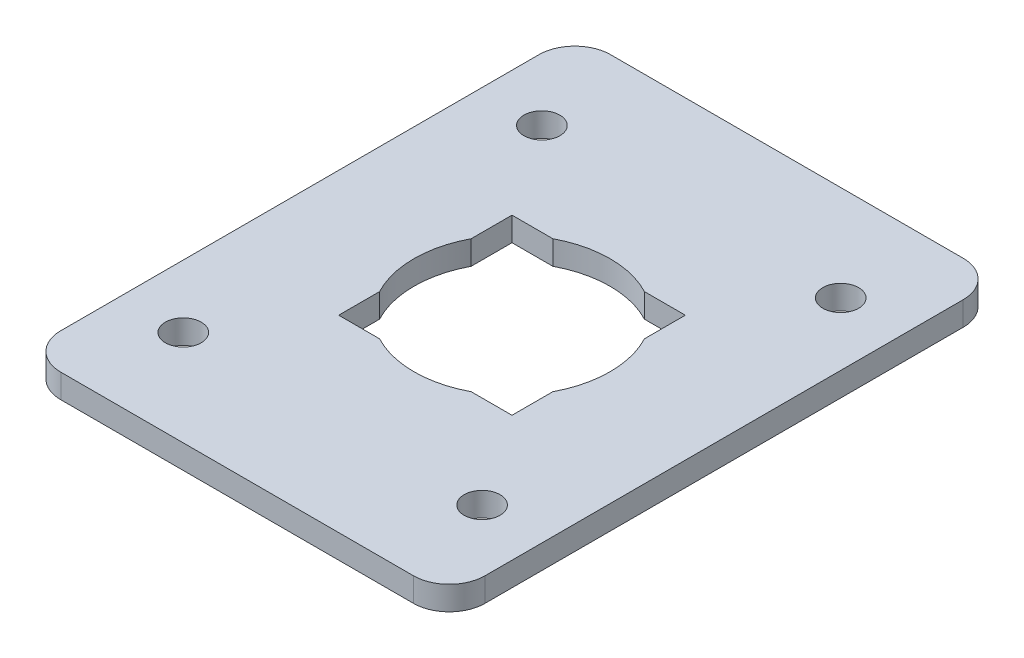
ISO-10303-21;
HEADER;
FILE_DESCRIPTION(('STEP AP214'),'2;1');
FILE_NAME('part.step','',(''),(''),'','','');
FILE_SCHEMA(('AUTOMOTIVE_DESIGN { 1 0 10303 214 1 1 1 1 }'));
ENDSEC;
DATA;
#1=APPLICATION_CONTEXT('core data for automotive mechanical design processes');
#2=APPLICATION_PROTOCOL_DEFINITION('international standard','automotive_design',2000,#1);
#3=PRODUCT_CONTEXT('',#1,'mechanical');
#4=PRODUCT('Part','Part','',(#3));
#5=PRODUCT_RELATED_PRODUCT_CATEGORY('part','',(#4));
#6=PRODUCT_DEFINITION_FORMATION('','',#4);
#7=PRODUCT_DEFINITION_CONTEXT('part definition',#1,'design');
#8=PRODUCT_DEFINITION('design','',#6,#7);
#9=PRODUCT_DEFINITION_SHAPE('','',#8);
#10=(LENGTH_UNIT() NAMED_UNIT(*) SI_UNIT(.MILLI.,.METRE.));
#11=(NAMED_UNIT(*) PLANE_ANGLE_UNIT() SI_UNIT($,.RADIAN.));
#12=(NAMED_UNIT(*) SI_UNIT($,.STERADIAN.) SOLID_ANGLE_UNIT());
#13=UNCERTAINTY_MEASURE_WITH_UNIT(LENGTH_MEASURE(1.E-05),#10,'distance_accuracy_value','');
#14=(GEOMETRIC_REPRESENTATION_CONTEXT(3) GLOBAL_UNCERTAINTY_ASSIGNED_CONTEXT((#13)) GLOBAL_UNIT_ASSIGNED_CONTEXT((#10,
#11,#12)) REPRESENTATION_CONTEXT('',''));
#15=CARTESIAN_POINT('',(0.,0.,0.));
#16=DIRECTION('',(0.,0.,1.));
#17=DIRECTION('',(1.,0.,0.));
#18=AXIS2_PLACEMENT_3D('',#15,#16,#17);
#19=CARTESIAN_POINT('',(0.,2.,0.));
#20=DIRECTION('',(0.,-1.,0.));
#21=DIRECTION('',(0.,0.,-1.));
#22=AXIS2_PLACEMENT_3D('',#19,#20,#21);
#23=PLANE('',#22);
#24=CARTESIAN_POINT('',(-11.6377120476314,2.,-22.25));
#25=DIRECTION('',(0.,-1.,0.));
#26=DIRECTION('',(0.,0.,-1.));
#27=AXIS2_PLACEMENT_3D('',#24,#25,#26);
#28=CIRCLE('',#27,1.5);
#29=CARTESIAN_POINT('',(-11.6377120476314,2.,-23.75));
#30=VERTEX_POINT('',#29);
#31=EDGE_CURVE('E228',#30,#30,#28,.T.);
#32=ORIENTED_EDGE('',*,*,#31,.T.);
#33=EDGE_LOOP('',(#32));
#34=FACE_BOUND('',#33,.T.);
#35=CARTESIAN_POINT('',(13.3622879523686,2.,7.75000000000001));
#36=DIRECTION('',(0.,-1.,0.));
#37=DIRECTION('',(0.,0.,-1.));
#38=AXIS2_PLACEMENT_3D('',#35,#36,#37);
#39=CIRCLE('',#38,1.5);
#40=CARTESIAN_POINT('',(13.3622879523686,2.,6.25000000000001));
#41=VERTEX_POINT('',#40);
#42=EDGE_CURVE('E631',#41,#41,#39,.T.);
#43=ORIENTED_EDGE('',*,*,#42,.T.);
#44=EDGE_LOOP('',(#43));
#45=FACE_BOUND('',#44,.T.);
#46=CARTESIAN_POINT('',(13.3622879523686,2.,-22.25));
#47=DIRECTION('',(0.,-1.,0.));
#48=DIRECTION('',(0.,0.,-1.));
#49=AXIS2_PLACEMENT_3D('',#46,#47,#48);
#50=CIRCLE('',#49,1.5);
#51=CARTESIAN_POINT('',(13.3622879523686,2.,-23.75));
#52=VERTEX_POINT('',#51);
#53=EDGE_CURVE('E633',#52,#52,#50,.T.);
#54=ORIENTED_EDGE('',*,*,#53,.T.);
#55=EDGE_LOOP('',(#54));
#56=FACE_BOUND('',#55,.T.);
#57=CARTESIAN_POINT('',(-11.6377120476314,2.,7.75000000000001));
#58=DIRECTION('',(0.,-1.,0.));
#59=DIRECTION('',(0.,0.,-1.));
#60=AXIS2_PLACEMENT_3D('',#57,#58,#59);
#61=CIRCLE('',#60,1.5);
#62=CARTESIAN_POINT('',(-11.6377120476314,2.,6.25));
#63=VERTEX_POINT('',#62);
#64=EDGE_CURVE('E638',#63,#63,#61,.T.);
#65=ORIENTED_EDGE('',*,*,#64,.T.);
#66=EDGE_LOOP('',(#65));
#67=FACE_BOUND('',#66,.T.);
#68=DIRECTION('',(1.,0.,0.));
#69=VECTOR('',#68,1.);
#70=CARTESIAN_POINT('',(-16.8877120476314,2.,15.75));
#71=LINE('',#70,#69);
#72=CARTESIAN_POINT('',(-13.8877120476314,2.,15.75));
#73=VERTEX_POINT('',#72);
#74=CARTESIAN_POINT('',(15.6122879523686,2.,15.75));
#75=VERTEX_POINT('',#74);
#76=EDGE_CURVE('E282',#73,#75,#71,.T.);
#77=ORIENTED_EDGE('',*,*,#76,.T.);
#78=CARTESIAN_POINT('',(15.6122879523686,2.,12.75));
#79=DIRECTION('',(0.,-1.,0.));
#80=DIRECTION('',(0.,0.,-1.));
#81=AXIS2_PLACEMENT_3D('',#78,#79,#80);
#82=CIRCLE('',#81,3.);
#83=CARTESIAN_POINT('',(18.6122879523686,2.,12.75));
#84=VERTEX_POINT('',#83);
#85=EDGE_CURVE('E322',#75,#84,#82,.F.);
#86=ORIENTED_EDGE('',*,*,#85,.T.);
#87=DIRECTION('',(0.,0.,-1.));
#88=VECTOR('',#87,1.);
#89=CARTESIAN_POINT('',(18.6122879523686,2.,15.75));
#90=LINE('',#89,#88);
#91=CARTESIAN_POINT('',(18.6122879523686,2.,-27.25));
#92=VERTEX_POINT('',#91);
#93=EDGE_CURVE('E286',#84,#92,#90,.T.);
#94=ORIENTED_EDGE('',*,*,#93,.T.);
#95=CARTESIAN_POINT('',(15.6122879523686,2.,-27.25));
#96=DIRECTION('',(0.,-1.,0.));
#97=DIRECTION('',(0.,0.,-1.));
#98=AXIS2_PLACEMENT_3D('',#95,#96,#97);
#99=CIRCLE('',#98,3.);
#100=CARTESIAN_POINT('',(15.6122879523686,2.,-30.25));
#101=VERTEX_POINT('',#100);
#102=EDGE_CURVE('E61',#92,#101,#99,.F.);
#103=ORIENTED_EDGE('',*,*,#102,.T.);
#104=DIRECTION('',(-1.,0.,0.));
#105=VECTOR('',#104,1.);
#106=CARTESIAN_POINT('',(-16.8877120476314,2.,-30.25));
#107=LINE('',#106,#105);
#108=CARTESIAN_POINT('',(-13.8877120476314,2.,-30.25));
#109=VERTEX_POINT('',#108);
#110=EDGE_CURVE('E288',#101,#109,#107,.T.);
#111=ORIENTED_EDGE('',*,*,#110,.T.);
#112=CARTESIAN_POINT('',(-13.8877120476314,2.,-27.25));
#113=DIRECTION('',(0.,-1.,0.));
#114=DIRECTION('',(0.,0.,-1.));
#115=AXIS2_PLACEMENT_3D('',#112,#113,#114);
#116=CIRCLE('',#115,3.);
#117=CARTESIAN_POINT('',(-16.8877120476314,2.,-27.25));
#118=VERTEX_POINT('',#117);
#119=EDGE_CURVE('E318',#109,#118,#116,.F.);
#120=ORIENTED_EDGE('',*,*,#119,.T.);
#121=DIRECTION('',(0.,0.,1.));
#122=VECTOR('',#121,1.);
#123=CARTESIAN_POINT('',(-16.8877120476314,2.,15.75));
#124=LINE('',#123,#122);
#125=CARTESIAN_POINT('',(-16.8877120476314,2.,12.75));
#126=VERTEX_POINT('',#125);
#127=EDGE_CURVE('E279',#118,#126,#124,.T.);
#128=ORIENTED_EDGE('',*,*,#127,.T.);
#129=CARTESIAN_POINT('',(-13.8877120476314,2.,12.75));
#130=DIRECTION('',(0.,-1.,0.));
#131=DIRECTION('',(0.,0.,-1.));
#132=AXIS2_PLACEMENT_3D('',#129,#130,#131);
#133=CIRCLE('',#132,3.);
#134=EDGE_CURVE('E320',#126,#73,#133,.F.);
#135=ORIENTED_EDGE('',*,*,#134,.T.);
#136=EDGE_LOOP('',(#77,#86,#94,#103,#111,#120,#128,#135));
#137=FACE_BOUND('',#136,.T.);
#138=DIRECTION('',(1.,0.,0.));
#139=VECTOR('',#138,1.);
#140=CARTESIAN_POINT('',(4.69341050326672,2.,0.));
#141=LINE('',#140,#139);
#142=CARTESIAN_POINT('',(4.69341050326672,2.,0.));
#143=VERTEX_POINT('',#142);
#144=CARTESIAN_POINT('',(8.11228795236863,2.,0.));
#145=VERTEX_POINT('',#144);
#146=EDGE_CURVE('E179',#143,#145,#141,.T.);
#147=ORIENTED_EDGE('',*,*,#146,.F.);
#148=CARTESIAN_POINT('',(0.862287952368626,2.,-7.25));
#149=DIRECTION('',(0.,1.,0.));
#150=DIRECTION('',(0.,0.,1.));
#151=AXIS2_PLACEMENT_3D('',#148,#149,#150);
#152=CIRCLE('',#151,8.2);
#153=CARTESIAN_POINT('',(-2.96883459852947,2.,0.));
#154=VERTEX_POINT('',#153);
#155=EDGE_CURVE('E224',#154,#143,#152,.T.);
#156=ORIENTED_EDGE('',*,*,#155,.F.);
#157=DIRECTION('',(1.,0.,0.));
#158=VECTOR('',#157,1.);
#159=CARTESIAN_POINT('',(-6.38771204763137,2.,0.));
#160=LINE('',#159,#158);
#161=CARTESIAN_POINT('',(-6.38771204763137,2.,0.));
#162=VERTEX_POINT('',#161);
#163=EDGE_CURVE('E221',#162,#154,#160,.T.);
#164=ORIENTED_EDGE('',*,*,#163,.F.);
#165=DIRECTION('',(0.,0.,1.));
#166=VECTOR('',#165,1.);
#167=CARTESIAN_POINT('',(-6.38771204763137,2.,-3.4188774491019));
#168=LINE('',#167,#166);
#169=CARTESIAN_POINT('',(-6.38771204763138,2.,-3.4188774491019));
#170=VERTEX_POINT('',#169);
#171=EDGE_CURVE('E219',#170,#162,#168,.T.);
#172=ORIENTED_EDGE('',*,*,#171,.F.);
#173=CARTESIAN_POINT('',(0.862287952368626,2.,-7.25));
#174=DIRECTION('',(0.,1.,0.));
#175=DIRECTION('',(0.,0.,1.));
#176=AXIS2_PLACEMENT_3D('',#173,#174,#175);
#177=CIRCLE('',#176,8.2);
#178=CARTESIAN_POINT('',(-6.38771204763137,2.,-11.0811225508981));
#179=VERTEX_POINT('',#178);
#180=EDGE_CURVE('E217',#179,#170,#177,.T.);
#181=ORIENTED_EDGE('',*,*,#180,.F.);
#182=DIRECTION('',(0.,0.,1.));
#183=VECTOR('',#182,1.);
#184=CARTESIAN_POINT('',(-6.38771204763137,2.,-14.5));
#185=LINE('',#184,#183);
#186=CARTESIAN_POINT('',(-6.38771204763137,2.,-14.5));
#187=VERTEX_POINT('',#186);
#188=EDGE_CURVE('E215',#187,#179,#185,.T.);
#189=ORIENTED_EDGE('',*,*,#188,.F.);
#190=DIRECTION('',(-1.,0.,0.));
#191=VECTOR('',#190,1.);
#192=CARTESIAN_POINT('',(-6.38771204763137,2.,-14.5));
#193=LINE('',#192,#191);
#194=CARTESIAN_POINT('',(-2.96883459852948,2.,-14.5));
#195=VERTEX_POINT('',#194);
#196=EDGE_CURVE('E213',#195,#187,#193,.T.);
#197=ORIENTED_EDGE('',*,*,#196,.F.);
#198=CARTESIAN_POINT('',(0.862287952368626,2.,-7.25));
#199=DIRECTION('',(0.,1.,0.));
#200=DIRECTION('',(0.,0.,1.));
#201=AXIS2_PLACEMENT_3D('',#198,#199,#200);
#202=CIRCLE('',#201,8.2);
#203=CARTESIAN_POINT('',(4.69341050326674,2.,-14.5));
#204=VERTEX_POINT('',#203);
#205=EDGE_CURVE('E211',#204,#195,#202,.T.);
#206=ORIENTED_EDGE('',*,*,#205,.F.);
#207=DIRECTION('',(-1.,0.,0.));
#208=VECTOR('',#207,1.);
#209=CARTESIAN_POINT('',(4.69341050326674,2.,-14.5));
#210=LINE('',#209,#208);
#211=CARTESIAN_POINT('',(8.11228795236863,2.,-14.5));
#212=VERTEX_POINT('',#211);
#213=EDGE_CURVE('E209',#212,#204,#210,.T.);
#214=ORIENTED_EDGE('',*,*,#213,.F.);
#215=DIRECTION('',(0.,0.,-1.));
#216=VECTOR('',#215,1.);
#217=CARTESIAN_POINT('',(8.11228795236863,2.,-14.5));
#218=LINE('',#217,#216);
#219=CARTESIAN_POINT('',(8.11228795236863,2.,-11.0811225508981));
#220=VERTEX_POINT('',#219);
#221=EDGE_CURVE('E204',#220,#212,#218,.T.);
#222=ORIENTED_EDGE('',*,*,#221,.F.);
#223=CARTESIAN_POINT('',(0.862287952368626,2.,-7.25));
#224=DIRECTION('',(0.,1.,0.));
#225=DIRECTION('',(0.,0.,1.));
#226=AXIS2_PLACEMENT_3D('',#223,#224,#225);
#227=CIRCLE('',#226,8.2);
#228=CARTESIAN_POINT('',(8.11228795236863,2.,-3.4188774491019));
#229=VERTEX_POINT('',#228);
#230=EDGE_CURVE('E202',#229,#220,#227,.T.);
#231=ORIENTED_EDGE('',*,*,#230,.F.);
#232=DIRECTION('',(0.,0.,-1.));
#233=VECTOR('',#232,1.);
#234=CARTESIAN_POINT('',(8.11228795236863,2.,-3.4188774491019));
#235=LINE('',#234,#233);
#236=EDGE_CURVE('E189',#145,#229,#235,.T.);
#237=ORIENTED_EDGE('',*,*,#236,.F.);
#238=EDGE_LOOP('',(#147,#156,#164,#172,#181,#189,#197,#206,#214,#222,#231,#237));
#239=FACE_BOUND('',#238,.T.);
#240=ADVANCED_FACE('F41',(#34,#45,#56,#67,#137,#239),#23,.F.);
#241=CARTESIAN_POINT('',(0.,0.,0.));
#242=DIRECTION('',(0.,-1.,0.));
#243=DIRECTION('',(0.,0.,-1.));
#244=AXIS2_PLACEMENT_3D('',#241,#242,#243);
#245=PLANE('',#244);
#246=CARTESIAN_POINT('',(-11.6377120476314,0.,-22.25));
#247=DIRECTION('',(0.,-1.,0.));
#248=DIRECTION('',(0.,0.,1.));
#249=AXIS2_PLACEMENT_3D('',#246,#247,#248);
#250=CIRCLE('',#249,1.5);
#251=CARTESIAN_POINT('',(-11.6377120476314,0.,-20.75));
#252=VERTEX_POINT('',#251);
#253=EDGE_CURVE('E629',#252,#252,#250,.T.);
#254=ORIENTED_EDGE('',*,*,#253,.F.);
#255=EDGE_LOOP('',(#254));
#256=FACE_BOUND('',#255,.T.);
#257=CARTESIAN_POINT('',(13.3622879523686,0.,7.75000000000001));
#258=DIRECTION('',(0.,-1.,0.));
#259=DIRECTION('',(0.,0.,1.));
#260=AXIS2_PLACEMENT_3D('',#257,#258,#259);
#261=CIRCLE('',#260,1.5);
#262=CARTESIAN_POINT('',(13.3622879523686,0.,9.25000000000001));
#263=VERTEX_POINT('',#262);
#264=EDGE_CURVE('E646',#263,#263,#261,.T.);
#265=ORIENTED_EDGE('',*,*,#264,.F.);
#266=EDGE_LOOP('',(#265));
#267=FACE_BOUND('',#266,.T.);
#268=CARTESIAN_POINT('',(13.3622879523686,0.,-22.25));
#269=DIRECTION('',(0.,-1.,0.));
#270=DIRECTION('',(0.,0.,-1.));
#271=AXIS2_PLACEMENT_3D('',#268,#269,#270);
#272=CIRCLE('',#271,1.5);
#273=CARTESIAN_POINT('',(13.3622879523686,0.,-23.75));
#274=VERTEX_POINT('',#273);
#275=EDGE_CURVE('E644',#274,#274,#272,.T.);
#276=ORIENTED_EDGE('',*,*,#275,.F.);
#277=EDGE_LOOP('',(#276));
#278=FACE_BOUND('',#277,.T.);
#279=CARTESIAN_POINT('',(-11.6377120476314,0.,7.75000000000001));
#280=DIRECTION('',(0.,-1.,0.));
#281=DIRECTION('',(0.,0.,-1.));
#282=AXIS2_PLACEMENT_3D('',#279,#280,#281);
#283=CIRCLE('',#282,1.5);
#284=CARTESIAN_POINT('',(-11.6377120476314,0.,6.25));
#285=VERTEX_POINT('',#284);
#286=EDGE_CURVE('E641',#285,#285,#283,.T.);
#287=ORIENTED_EDGE('',*,*,#286,.F.);
#288=EDGE_LOOP('',(#287));
#289=FACE_BOUND('',#288,.T.);
#290=DIRECTION('',(0.,0.,-1.));
#291=VECTOR('',#290,1.);
#292=CARTESIAN_POINT('',(18.6122879523686,0.,15.75));
#293=LINE('',#292,#291);
#294=CARTESIAN_POINT('',(18.6122879523686,0.,12.75));
#295=VERTEX_POINT('',#294);
#296=CARTESIAN_POINT('',(18.6122879523686,0.,-27.25));
#297=VERTEX_POINT('',#296);
#298=EDGE_CURVE('E296',#295,#297,#293,.T.);
#299=ORIENTED_EDGE('',*,*,#298,.F.);
#300=CARTESIAN_POINT('',(15.6122879523686,0.,12.75));
#301=DIRECTION('',(0.,-1.,0.));
#302=DIRECTION('',(0.,0.,-1.));
#303=AXIS2_PLACEMENT_3D('',#300,#301,#302);
#304=CIRCLE('',#303,3.);
#305=CARTESIAN_POINT('',(15.6122879523686,0.,15.75));
#306=VERTEX_POINT('',#305);
#307=EDGE_CURVE('E310',#295,#306,#304,.T.);
#308=ORIENTED_EDGE('',*,*,#307,.T.);
#309=DIRECTION('',(1.,0.,0.));
#310=VECTOR('',#309,1.);
#311=CARTESIAN_POINT('',(-16.8877120476314,0.,15.75));
#312=LINE('',#311,#310);
#313=CARTESIAN_POINT('',(-13.8877120476314,0.,15.75));
#314=VERTEX_POINT('',#313);
#315=EDGE_CURVE('E293',#314,#306,#312,.T.);
#316=ORIENTED_EDGE('',*,*,#315,.F.);
#317=CARTESIAN_POINT('',(-13.8877120476314,0.,12.75));
#318=DIRECTION('',(0.,-1.,0.));
#319=DIRECTION('',(0.,0.,-1.));
#320=AXIS2_PLACEMENT_3D('',#317,#318,#319);
#321=CIRCLE('',#320,3.);
#322=CARTESIAN_POINT('',(-16.8877120476314,0.,12.75));
#323=VERTEX_POINT('',#322);
#324=EDGE_CURVE('E308',#314,#323,#321,.T.);
#325=ORIENTED_EDGE('',*,*,#324,.T.);
#326=DIRECTION('',(0.,0.,1.));
#327=VECTOR('',#326,1.);
#328=CARTESIAN_POINT('',(-16.8877120476314,0.,15.75));
#329=LINE('',#328,#327);
#330=CARTESIAN_POINT('',(-16.8877120476314,0.,-27.25));
#331=VERTEX_POINT('',#330);
#332=EDGE_CURVE('E197',#331,#323,#329,.T.);
#333=ORIENTED_EDGE('',*,*,#332,.F.);
#334=CARTESIAN_POINT('',(-13.8877120476314,0.,-27.25));
#335=DIRECTION('',(0.,-1.,0.));
#336=DIRECTION('',(0.,0.,-1.));
#337=AXIS2_PLACEMENT_3D('',#334,#335,#336);
#338=CIRCLE('',#337,3.);
#339=CARTESIAN_POINT('',(-13.8877120476314,0.,-30.25));
#340=VERTEX_POINT('',#339);
#341=EDGE_CURVE('E306',#331,#340,#338,.T.);
#342=ORIENTED_EDGE('',*,*,#341,.T.);
#343=DIRECTION('',(-1.,0.,0.));
#344=VECTOR('',#343,1.);
#345=CARTESIAN_POINT('',(-16.8877120476314,0.,-30.25));
#346=LINE('',#345,#344);
#347=CARTESIAN_POINT('',(15.6122879523686,0.,-30.25));
#348=VERTEX_POINT('',#347);
#349=EDGE_CURVE('E283',#348,#340,#346,.T.);
#350=ORIENTED_EDGE('',*,*,#349,.F.);
#351=CARTESIAN_POINT('',(15.6122879523686,0.,-27.25));
#352=DIRECTION('',(0.,-1.,0.));
#353=DIRECTION('',(0.,0.,-1.));
#354=AXIS2_PLACEMENT_3D('',#351,#352,#353);
#355=CIRCLE('',#354,3.);
#356=EDGE_CURVE('E304',#348,#297,#355,.T.);
#357=ORIENTED_EDGE('',*,*,#356,.T.);
#358=EDGE_LOOP('',(#299,#308,#316,#325,#333,#342,#350,#357));
#359=FACE_BOUND('',#358,.T.);
#360=CARTESIAN_POINT('',(0.862287952368626,0.,-7.25));
#361=DIRECTION('',(0.,1.,0.));
#362=DIRECTION('',(0.,0.,1.));
#363=AXIS2_PLACEMENT_3D('',#360,#361,#362);
#364=CIRCLE('',#363,8.2);
#365=CARTESIAN_POINT('',(-2.96883459852947,0.,0.));
#366=VERTEX_POINT('',#365);
#367=CARTESIAN_POINT('',(4.69341050326672,0.,0.));
#368=VERTEX_POINT('',#367);
#369=EDGE_CURVE('E190',#366,#368,#364,.T.);
#370=ORIENTED_EDGE('',*,*,#369,.T.);
#371=DIRECTION('',(1.,0.,0.));
#372=VECTOR('',#371,1.);
#373=CARTESIAN_POINT('',(4.69341050326672,0.,0.));
#374=LINE('',#373,#372);
#375=CARTESIAN_POINT('',(8.11228795236863,0.,0.));
#376=VERTEX_POINT('',#375);
#377=EDGE_CURVE('E226',#368,#376,#374,.T.);
#378=ORIENTED_EDGE('',*,*,#377,.T.);
#379=DIRECTION('',(0.,0.,-1.));
#380=VECTOR('',#379,1.);
#381=CARTESIAN_POINT('',(8.11228795236863,0.,-3.4188774491019));
#382=LINE('',#381,#380);
#383=CARTESIAN_POINT('',(8.11228795236863,0.,-3.4188774491019));
#384=VERTEX_POINT('',#383);
#385=EDGE_CURVE('E196',#376,#384,#382,.T.);
#386=ORIENTED_EDGE('',*,*,#385,.T.);
#387=CARTESIAN_POINT('',(0.862287952368626,0.,-7.25));
#388=DIRECTION('',(0.,1.,0.));
#389=DIRECTION('',(0.,0.,1.));
#390=AXIS2_PLACEMENT_3D('',#387,#388,#389);
#391=CIRCLE('',#390,8.2);
#392=CARTESIAN_POINT('',(8.11228795236863,0.,-11.0811225508981));
#393=VERTEX_POINT('',#392);
#394=EDGE_CURVE('E230',#384,#393,#391,.T.);
#395=ORIENTED_EDGE('',*,*,#394,.T.);
#396=DIRECTION('',(0.,0.,-1.));
#397=VECTOR('',#396,1.);
#398=CARTESIAN_POINT('',(8.11228795236863,0.,-14.5));
#399=LINE('',#398,#397);
#400=CARTESIAN_POINT('',(8.11228795236863,0.,-14.5));
#401=VERTEX_POINT('',#400);
#402=EDGE_CURVE('E233',#393,#401,#399,.T.);
#403=ORIENTED_EDGE('',*,*,#402,.T.);
#404=DIRECTION('',(-1.,0.,0.));
#405=VECTOR('',#404,1.);
#406=CARTESIAN_POINT('',(4.69341050326674,0.,-14.5));
#407=LINE('',#406,#405);
#408=CARTESIAN_POINT('',(4.69341050326674,0.,-14.5));
#409=VERTEX_POINT('',#408);
#410=EDGE_CURVE('E236',#401,#409,#407,.T.);
#411=ORIENTED_EDGE('',*,*,#410,.T.);
#412=CARTESIAN_POINT('',(0.862287952368626,0.,-7.25));
#413=DIRECTION('',(0.,1.,0.));
#414=DIRECTION('',(0.,0.,1.));
#415=AXIS2_PLACEMENT_3D('',#412,#413,#414);
#416=CIRCLE('',#415,8.2);
#417=CARTESIAN_POINT('',(-2.96883459852948,0.,-14.5));
#418=VERTEX_POINT('',#417);
#419=EDGE_CURVE('E239',#409,#418,#416,.T.);
#420=ORIENTED_EDGE('',*,*,#419,.T.);
#421=DIRECTION('',(-1.,0.,0.));
#422=VECTOR('',#421,1.);
#423=CARTESIAN_POINT('',(-6.38771204763137,0.,-14.5));
#424=LINE('',#423,#422);
#425=CARTESIAN_POINT('',(-6.38771204763137,0.,-14.5));
#426=VERTEX_POINT('',#425);
#427=EDGE_CURVE('E242',#418,#426,#424,.T.);
#428=ORIENTED_EDGE('',*,*,#427,.T.);
#429=DIRECTION('',(0.,0.,1.));
#430=VECTOR('',#429,1.);
#431=CARTESIAN_POINT('',(-6.38771204763137,0.,-14.5));
#432=LINE('',#431,#430);
#433=CARTESIAN_POINT('',(-6.38771204763137,0.,-11.0811225508981));
#434=VERTEX_POINT('',#433);
#435=EDGE_CURVE('E245',#426,#434,#432,.T.);
#436=ORIENTED_EDGE('',*,*,#435,.T.);
#437=CARTESIAN_POINT('',(0.862287952368626,0.,-7.25));
#438=DIRECTION('',(0.,1.,0.));
#439=DIRECTION('',(0.,0.,1.));
#440=AXIS2_PLACEMENT_3D('',#437,#438,#439);
#441=CIRCLE('',#440,8.2);
#442=CARTESIAN_POINT('',(-6.38771204763138,0.,-3.4188774491019));
#443=VERTEX_POINT('',#442);
#444=EDGE_CURVE('E248',#434,#443,#441,.T.);
#445=ORIENTED_EDGE('',*,*,#444,.T.);
#446=DIRECTION('',(0.,0.,1.));
#447=VECTOR('',#446,1.);
#448=CARTESIAN_POINT('',(-6.38771204763137,0.,-3.4188774491019));
#449=LINE('',#448,#447);
#450=CARTESIAN_POINT('',(-6.38771204763137,0.,0.));
#451=VERTEX_POINT('',#450);
#452=EDGE_CURVE('E251',#443,#451,#449,.T.);
#453=ORIENTED_EDGE('',*,*,#452,.T.);
#454=DIRECTION('',(1.,0.,0.));
#455=VECTOR('',#454,1.);
#456=CARTESIAN_POINT('',(-6.38771204763137,0.,0.));
#457=LINE('',#456,#455);
#458=EDGE_CURVE('E254',#451,#366,#457,.T.);
#459=ORIENTED_EDGE('',*,*,#458,.T.);
#460=EDGE_LOOP('',(#370,#378,#386,#395,#403,#411,#420,#428,#436,#445,#453,#459));
#461=FACE_BOUND('',#460,.T.);
#462=ADVANCED_FACE('F335',(#256,#267,#278,#289,#359,#461),#245,.T.);
#463=CARTESIAN_POINT('',(-16.8877120476314,2.,15.75));
#464=DIRECTION('',(1.,0.,0.));
#465=DIRECTION('',(0.,0.,-1.));
#466=AXIS2_PLACEMENT_3D('',#463,#464,#465);
#467=PLANE('',#466);
#468=ORIENTED_EDGE('',*,*,#332,.T.);
#469=DIRECTION('',(0.,-1.,0.));
#470=VECTOR('',#469,1.);
#471=CARTESIAN_POINT('',(-16.8877120476314,2.,12.75));
#472=LINE('',#471,#470);
#473=EDGE_CURVE('E327',#323,#126,#472,.F.);
#474=ORIENTED_EDGE('',*,*,#473,.T.);
#475=ORIENTED_EDGE('',*,*,#127,.F.);
#476=DIRECTION('',(0.,-1.,0.));
#477=VECTOR('',#476,1.);
#478=CARTESIAN_POINT('',(-16.8877120476314,2.,-27.25));
#479=LINE('',#478,#477);
#480=EDGE_CURVE('E324',#118,#331,#479,.T.);
#481=ORIENTED_EDGE('',*,*,#480,.T.);
#482=EDGE_LOOP('',(#468,#474,#475,#481));
#483=FACE_BOUND('',#482,.T.);
#484=ADVANCED_FACE('F344',(#483),#467,.F.);
#485=CARTESIAN_POINT('',(-16.8877120476314,2.,15.75));
#486=DIRECTION('',(0.,0.,-1.));
#487=DIRECTION('',(-1.,0.,0.));
#488=AXIS2_PLACEMENT_3D('',#485,#486,#487);
#489=PLANE('',#488);
#490=ORIENTED_EDGE('',*,*,#315,.T.);
#491=DIRECTION('',(0.,-1.,0.));
#492=VECTOR('',#491,1.);
#493=CARTESIAN_POINT('',(15.6122879523686,2.,15.75));
#494=LINE('',#493,#492);
#495=EDGE_CURVE('E315',#306,#75,#494,.F.);
#496=ORIENTED_EDGE('',*,*,#495,.T.);
#497=ORIENTED_EDGE('',*,*,#76,.F.);
#498=DIRECTION('',(0.,-1.,0.));
#499=VECTOR('',#498,1.);
#500=CARTESIAN_POINT('',(-13.8877120476314,2.,15.75));
#501=LINE('',#500,#499);
#502=EDGE_CURVE('E312',#73,#314,#501,.T.);
#503=ORIENTED_EDGE('',*,*,#502,.T.);
#504=EDGE_LOOP('',(#490,#496,#497,#503));
#505=FACE_BOUND('',#504,.T.);
#506=ADVANCED_FACE('F353',(#505),#489,.F.);
#507=CARTESIAN_POINT('',(18.6122879523686,2.,15.75));
#508=DIRECTION('',(-1.,0.,0.));
#509=DIRECTION('',(0.,0.,1.));
#510=AXIS2_PLACEMENT_3D('',#507,#508,#509);
#511=PLANE('',#510);
#512=ORIENTED_EDGE('',*,*,#93,.F.);
#513=DIRECTION('',(0.,-1.,0.));
#514=VECTOR('',#513,1.);
#515=CARTESIAN_POINT('',(18.6122879523686,2.,12.75));
#516=LINE('',#515,#514);
#517=EDGE_CURVE('E301',#84,#295,#516,.T.);
#518=ORIENTED_EDGE('',*,*,#517,.T.);
#519=ORIENTED_EDGE('',*,*,#298,.T.);
#520=DIRECTION('',(0.,-1.,0.));
#521=VECTOR('',#520,1.);
#522=CARTESIAN_POINT('',(18.6122879523686,2.,-27.25));
#523=LINE('',#522,#521);
#524=EDGE_CURVE('E290',#297,#92,#523,.F.);
#525=ORIENTED_EDGE('',*,*,#524,.T.);
#526=EDGE_LOOP('',(#512,#518,#519,#525));
#527=FACE_BOUND('',#526,.T.);
#528=ADVANCED_FACE('F361',(#527),#511,.F.);
#529=CARTESIAN_POINT('',(-16.8877120476314,2.,-30.25));
#530=DIRECTION('',(0.,0.,1.));
#531=DIRECTION('',(1.,0.,0.));
#532=AXIS2_PLACEMENT_3D('',#529,#530,#531);
#533=PLANE('',#532);
#534=ORIENTED_EDGE('',*,*,#349,.T.);
#535=DIRECTION('',(0.,-1.,0.));
#536=VECTOR('',#535,1.);
#537=CARTESIAN_POINT('',(-13.8877120476314,2.,-30.25));
#538=LINE('',#537,#536);
#539=EDGE_CURVE('E11',#340,#109,#538,.F.);
#540=ORIENTED_EDGE('',*,*,#539,.T.);
#541=ORIENTED_EDGE('',*,*,#110,.F.);
#542=DIRECTION('',(0.,-1.,0.));
#543=VECTOR('',#542,1.);
#544=CARTESIAN_POINT('',(15.6122879523686,2.,-30.25));
#545=LINE('',#544,#543);
#546=EDGE_CURVE('E49',#101,#348,#545,.T.);
#547=ORIENTED_EDGE('',*,*,#546,.T.);
#548=EDGE_LOOP('',(#534,#540,#541,#547));
#549=FACE_BOUND('',#548,.T.);
#550=ADVANCED_FACE('F331',(#549),#533,.F.);
#551=CARTESIAN_POINT('',(4.69341050326672,2.,0.));
#552=DIRECTION('',(0.,0.,-1.));
#553=DIRECTION('',(-1.,0.,0.));
#554=AXIS2_PLACEMENT_3D('',#551,#552,#553);
#555=PLANE('',#554);
#556=ORIENTED_EDGE('',*,*,#377,.F.);
#557=DIRECTION('',(0.,-1.,0.));
#558=VECTOR('',#557,1.);
#559=CARTESIAN_POINT('',(4.69341050326672,2.,0.));
#560=LINE('',#559,#558);
#561=EDGE_CURVE('E185',#143,#368,#560,.T.);
#562=ORIENTED_EDGE('',*,*,#561,.F.);
#563=ORIENTED_EDGE('',*,*,#146,.T.);
#564=DIRECTION('',(0.,-1.,0.));
#565=VECTOR('',#564,1.);
#566=CARTESIAN_POINT('',(8.11228795236863,2.,0.));
#567=LINE('',#566,#565);
#568=EDGE_CURVE('E182',#145,#376,#567,.T.);
#569=ORIENTED_EDGE('',*,*,#568,.T.);
#570=EDGE_LOOP('',(#556,#562,#563,#569));
#571=FACE_BOUND('',#570,.T.);
#572=ADVANCED_FACE('F181',(#571),#555,.T.);
#573=CARTESIAN_POINT('',(8.11228795236863,2.,-3.4188774491019));
#574=DIRECTION('',(-1.,0.,0.));
#575=DIRECTION('',(0.,0.,1.));
#576=AXIS2_PLACEMENT_3D('',#573,#574,#575);
#577=PLANE('',#576);
#578=ORIENTED_EDGE('',*,*,#385,.F.);
#579=ORIENTED_EDGE('',*,*,#568,.F.);
#580=ORIENTED_EDGE('',*,*,#236,.T.);
#581=DIRECTION('',(0.,-1.,0.));
#582=VECTOR('',#581,1.);
#583=CARTESIAN_POINT('',(8.11228795236863,2.,-3.4188774491019));
#584=LINE('',#583,#582);
#585=EDGE_CURVE('E198',#229,#384,#584,.T.);
#586=ORIENTED_EDGE('',*,*,#585,.T.);
#587=EDGE_LOOP('',(#578,#579,#580,#586));
#588=FACE_BOUND('',#587,.T.);
#589=ADVANCED_FACE('F193',(#588),#577,.T.);
#590=CARTESIAN_POINT('',(0.862287952368626,2.,-7.25));
#591=DIRECTION('',(0.,-1.,0.));
#592=DIRECTION('',(0.,0.,-1.));
#593=AXIS2_PLACEMENT_3D('',#590,#591,#592);
#594=CYLINDRICAL_SURFACE('',#593,8.2);
#595=ORIENTED_EDGE('',*,*,#394,.F.);
#596=ORIENTED_EDGE('',*,*,#585,.F.);
#597=ORIENTED_EDGE('',*,*,#230,.T.);
#598=DIRECTION('',(0.,-1.,0.));
#599=VECTOR('',#598,1.);
#600=CARTESIAN_POINT('',(8.11228795236863,2.,-11.0811225508981));
#601=LINE('',#600,#599);
#602=EDGE_CURVE('E276',#220,#393,#601,.T.);
#603=ORIENTED_EDGE('',*,*,#602,.T.);
#604=EDGE_LOOP('',(#595,#596,#597,#603));
#605=FACE_BOUND('',#604,.T.);
#606=ADVANCED_FACE('F496',(#605),#594,.F.);
#607=CARTESIAN_POINT('',(8.11228795236863,2.,-14.5));
#608=DIRECTION('',(-1.,0.,0.));
#609=DIRECTION('',(0.,0.,1.));
#610=AXIS2_PLACEMENT_3D('',#607,#608,#609);
#611=PLANE('',#610);
#612=ORIENTED_EDGE('',*,*,#402,.F.);
#613=ORIENTED_EDGE('',*,*,#602,.F.);
#614=ORIENTED_EDGE('',*,*,#221,.T.);
#615=DIRECTION('',(0.,-1.,0.));
#616=VECTOR('',#615,1.);
#617=CARTESIAN_POINT('',(8.11228795236863,2.,-14.5));
#618=LINE('',#617,#616);
#619=EDGE_CURVE('E274',#212,#401,#618,.T.);
#620=ORIENTED_EDGE('',*,*,#619,.T.);
#621=EDGE_LOOP('',(#612,#613,#614,#620));
#622=FACE_BOUND('',#621,.T.);
#623=ADVANCED_FACE('F492',(#622),#611,.T.);
#624=CARTESIAN_POINT('',(4.69341050326674,2.,-14.5));
#625=DIRECTION('',(0.,0.,1.));
#626=DIRECTION('',(1.,0.,0.));
#627=AXIS2_PLACEMENT_3D('',#624,#625,#626);
#628=PLANE('',#627);
#629=ORIENTED_EDGE('',*,*,#410,.F.);
#630=ORIENTED_EDGE('',*,*,#619,.F.);
#631=ORIENTED_EDGE('',*,*,#213,.T.);
#632=DIRECTION('',(0.,-1.,0.));
#633=VECTOR('',#632,1.);
#634=CARTESIAN_POINT('',(4.69341050326674,2.,-14.5));
#635=LINE('',#634,#633);
#636=EDGE_CURVE('E272',#204,#409,#635,.T.);
#637=ORIENTED_EDGE('',*,*,#636,.T.);
#638=EDGE_LOOP('',(#629,#630,#631,#637));
#639=FACE_BOUND('',#638,.T.);
#640=ADVANCED_FACE('F488',(#639),#628,.T.);
#641=CARTESIAN_POINT('',(0.862287952368626,2.,-7.25));
#642=DIRECTION('',(0.,-1.,0.));
#643=DIRECTION('',(0.,0.,-1.));
#644=AXIS2_PLACEMENT_3D('',#641,#642,#643);
#645=CYLINDRICAL_SURFACE('',#644,8.2);
#646=ORIENTED_EDGE('',*,*,#419,.F.);
#647=ORIENTED_EDGE('',*,*,#636,.F.);
#648=ORIENTED_EDGE('',*,*,#205,.T.);
#649=DIRECTION('',(0.,-1.,0.));
#650=VECTOR('',#649,1.);
#651=CARTESIAN_POINT('',(-2.96883459852948,2.,-14.5));
#652=LINE('',#651,#650);
#653=EDGE_CURVE('E270',#195,#418,#652,.T.);
#654=ORIENTED_EDGE('',*,*,#653,.T.);
#655=EDGE_LOOP('',(#646,#647,#648,#654));
#656=FACE_BOUND('',#655,.T.);
#657=ADVANCED_FACE('F484',(#656),#645,.F.);
#658=CARTESIAN_POINT('',(-6.38771204763137,2.,-14.5));
#659=DIRECTION('',(0.,0.,1.));
#660=DIRECTION('',(1.,0.,0.));
#661=AXIS2_PLACEMENT_3D('',#658,#659,#660);
#662=PLANE('',#661);
#663=ORIENTED_EDGE('',*,*,#427,.F.);
#664=ORIENTED_EDGE('',*,*,#653,.F.);
#665=ORIENTED_EDGE('',*,*,#196,.T.);
#666=DIRECTION('',(0.,-1.,0.));
#667=VECTOR('',#666,1.);
#668=CARTESIAN_POINT('',(-6.38771204763137,2.,-14.5));
#669=LINE('',#668,#667);
#670=EDGE_CURVE('E268',#187,#426,#669,.T.);
#671=ORIENTED_EDGE('',*,*,#670,.T.);
#672=EDGE_LOOP('',(#663,#664,#665,#671));
#673=FACE_BOUND('',#672,.T.);
#674=ADVANCED_FACE('F480',(#673),#662,.T.);
#675=CARTESIAN_POINT('',(-6.38771204763137,2.,-14.5));
#676=DIRECTION('',(1.,0.,0.));
#677=DIRECTION('',(0.,0.,-1.));
#678=AXIS2_PLACEMENT_3D('',#675,#676,#677);
#679=PLANE('',#678);
#680=ORIENTED_EDGE('',*,*,#435,.F.);
#681=ORIENTED_EDGE('',*,*,#670,.F.);
#682=ORIENTED_EDGE('',*,*,#188,.T.);
#683=DIRECTION('',(0.,-1.,0.));
#684=VECTOR('',#683,1.);
#685=CARTESIAN_POINT('',(-6.38771204763137,2.,-11.0811225508981));
#686=LINE('',#685,#684);
#687=EDGE_CURVE('E266',#179,#434,#686,.T.);
#688=ORIENTED_EDGE('',*,*,#687,.T.);
#689=EDGE_LOOP('',(#680,#681,#682,#688));
#690=FACE_BOUND('',#689,.T.);
#691=ADVANCED_FACE('F476',(#690),#679,.T.);
#692=CARTESIAN_POINT('',(0.862287952368626,2.,-7.25));
#693=DIRECTION('',(0.,-1.,0.));
#694=DIRECTION('',(0.,0.,-1.));
#695=AXIS2_PLACEMENT_3D('',#692,#693,#694);
#696=CYLINDRICAL_SURFACE('',#695,8.2);
#697=ORIENTED_EDGE('',*,*,#444,.F.);
#698=ORIENTED_EDGE('',*,*,#687,.F.);
#699=ORIENTED_EDGE('',*,*,#180,.T.);
#700=DIRECTION('',(0.,-1.,0.));
#701=VECTOR('',#700,1.);
#702=CARTESIAN_POINT('',(-6.38771204763138,2.,-3.4188774491019));
#703=LINE('',#702,#701);
#704=EDGE_CURVE('E264',#170,#443,#703,.T.);
#705=ORIENTED_EDGE('',*,*,#704,.T.);
#706=EDGE_LOOP('',(#697,#698,#699,#705));
#707=FACE_BOUND('',#706,.T.);
#708=ADVANCED_FACE('F472',(#707),#696,.F.);
#709=CARTESIAN_POINT('',(-6.38771204763137,2.,-3.4188774491019));
#710=DIRECTION('',(1.,0.,0.));
#711=DIRECTION('',(0.,0.,-1.));
#712=AXIS2_PLACEMENT_3D('',#709,#710,#711);
#713=PLANE('',#712);
#714=ORIENTED_EDGE('',*,*,#452,.F.);
#715=ORIENTED_EDGE('',*,*,#704,.F.);
#716=ORIENTED_EDGE('',*,*,#171,.T.);
#717=DIRECTION('',(0.,-1.,0.));
#718=VECTOR('',#717,1.);
#719=CARTESIAN_POINT('',(-6.38771204763137,2.,0.));
#720=LINE('',#719,#718);
#721=EDGE_CURVE('E262',#162,#451,#720,.T.);
#722=ORIENTED_EDGE('',*,*,#721,.T.);
#723=EDGE_LOOP('',(#714,#715,#716,#722));
#724=FACE_BOUND('',#723,.T.);
#725=ADVANCED_FACE('F468',(#724),#713,.T.);
#726=CARTESIAN_POINT('',(-6.38771204763137,2.,0.));
#727=DIRECTION('',(0.,0.,-1.));
#728=DIRECTION('',(-1.,0.,0.));
#729=AXIS2_PLACEMENT_3D('',#726,#727,#728);
#730=PLANE('',#729);
#731=ORIENTED_EDGE('',*,*,#458,.F.);
#732=ORIENTED_EDGE('',*,*,#721,.F.);
#733=ORIENTED_EDGE('',*,*,#163,.T.);
#734=DIRECTION('',(0.,-1.,0.));
#735=VECTOR('',#734,1.);
#736=CARTESIAN_POINT('',(-2.96883459852947,2.,0.));
#737=LINE('',#736,#735);
#738=EDGE_CURVE('E260',#154,#366,#737,.T.);
#739=ORIENTED_EDGE('',*,*,#738,.T.);
#740=EDGE_LOOP('',(#731,#732,#733,#739));
#741=FACE_BOUND('',#740,.T.);
#742=ADVANCED_FACE('F464',(#741),#730,.T.);
#743=CARTESIAN_POINT('',(0.862287952368626,2.,-7.25));
#744=DIRECTION('',(0.,-1.,0.));
#745=DIRECTION('',(0.,0.,-1.));
#746=AXIS2_PLACEMENT_3D('',#743,#744,#745);
#747=CYLINDRICAL_SURFACE('',#746,8.2);
#748=ORIENTED_EDGE('',*,*,#369,.F.);
#749=ORIENTED_EDGE('',*,*,#738,.F.);
#750=ORIENTED_EDGE('',*,*,#155,.T.);
#751=ORIENTED_EDGE('',*,*,#561,.T.);
#752=EDGE_LOOP('',(#748,#749,#750,#751));
#753=FACE_BOUND('',#752,.T.);
#754=ADVANCED_FACE('F395',(#753),#747,.F.);
#755=CARTESIAN_POINT('',(15.6122879523686,2.,12.75));
#756=DIRECTION('',(0.,-1.,0.));
#757=DIRECTION('',(0.,0.,-1.));
#758=AXIS2_PLACEMENT_3D('',#755,#756,#757);
#759=CYLINDRICAL_SURFACE('',#758,3.);
#760=ORIENTED_EDGE('',*,*,#85,.F.);
#761=ORIENTED_EDGE('',*,*,#495,.F.);
#762=ORIENTED_EDGE('',*,*,#307,.F.);
#763=ORIENTED_EDGE('',*,*,#517,.F.);
#764=EDGE_LOOP('',(#760,#761,#762,#763));
#765=FACE_BOUND('',#764,.T.);
#766=ADVANCED_FACE('F358',(#765),#759,.T.);
#767=CARTESIAN_POINT('',(-13.8877120476314,2.,12.75));
#768=DIRECTION('',(0.,-1.,0.));
#769=DIRECTION('',(0.,0.,-1.));
#770=AXIS2_PLACEMENT_3D('',#767,#768,#769);
#771=CYLINDRICAL_SURFACE('',#770,3.);
#772=ORIENTED_EDGE('',*,*,#134,.F.);
#773=ORIENTED_EDGE('',*,*,#473,.F.);
#774=ORIENTED_EDGE('',*,*,#324,.F.);
#775=ORIENTED_EDGE('',*,*,#502,.F.);
#776=EDGE_LOOP('',(#772,#773,#774,#775));
#777=FACE_BOUND('',#776,.T.);
#778=ADVANCED_FACE('F350',(#777),#771,.T.);
#779=CARTESIAN_POINT('',(-13.8877120476314,2.,-27.25));
#780=DIRECTION('',(0.,-1.,0.));
#781=DIRECTION('',(0.,0.,-1.));
#782=AXIS2_PLACEMENT_3D('',#779,#780,#781);
#783=CYLINDRICAL_SURFACE('',#782,3.);
#784=ORIENTED_EDGE('',*,*,#119,.F.);
#785=ORIENTED_EDGE('',*,*,#539,.F.);
#786=ORIENTED_EDGE('',*,*,#341,.F.);
#787=ORIENTED_EDGE('',*,*,#480,.F.);
#788=EDGE_LOOP('',(#784,#785,#786,#787));
#789=FACE_BOUND('',#788,.T.);
#790=ADVANCED_FACE('F341',(#789),#783,.T.);
#791=CARTESIAN_POINT('',(15.6122879523686,2.,-27.25));
#792=DIRECTION('',(0.,-1.,0.));
#793=DIRECTION('',(0.,0.,-1.));
#794=AXIS2_PLACEMENT_3D('',#791,#792,#793);
#795=CYLINDRICAL_SURFACE('',#794,3.);
#796=ORIENTED_EDGE('',*,*,#102,.F.);
#797=ORIENTED_EDGE('',*,*,#524,.F.);
#798=ORIENTED_EDGE('',*,*,#356,.F.);
#799=ORIENTED_EDGE('',*,*,#546,.F.);
#800=EDGE_LOOP('',(#796,#797,#798,#799));
#801=FACE_BOUND('',#800,.T.);
#802=ADVANCED_FACE('F43',(#801),#795,.T.);
#803=CARTESIAN_POINT('',(-11.6377120476314,10.,7.75000000000001));
#804=DIRECTION('',(0.,-1.,0.));
#805=DIRECTION('',(0.,0.,-1.));
#806=AXIS2_PLACEMENT_3D('',#803,#804,#805);
#807=CYLINDRICAL_SURFACE('',#806,1.5);
#808=ORIENTED_EDGE('',*,*,#286,.T.);
#809=EDGE_LOOP('',(#808));
#810=FACE_BOUND('',#809,.T.);
#811=ORIENTED_EDGE('',*,*,#64,.F.);
#812=EDGE_LOOP('',(#811));
#813=FACE_BOUND('',#812,.T.);
#814=ADVANCED_FACE('F364',(#810,#813),#807,.F.);
#815=CARTESIAN_POINT('',(13.3622879523686,10.,-22.25));
#816=DIRECTION('',(0.,-1.,0.));
#817=DIRECTION('',(0.,0.,-1.));
#818=AXIS2_PLACEMENT_3D('',#815,#816,#817);
#819=CYLINDRICAL_SURFACE('',#818,1.5);
#820=ORIENTED_EDGE('',*,*,#275,.T.);
#821=EDGE_LOOP('',(#820));
#822=FACE_BOUND('',#821,.T.);
#823=ORIENTED_EDGE('',*,*,#53,.F.);
#824=EDGE_LOOP('',(#823));
#825=FACE_BOUND('',#824,.T.);
#826=ADVANCED_FACE('F369',(#822,#825),#819,.F.);
#827=CARTESIAN_POINT('',(13.3622879523686,10.,7.75000000000001));
#828=DIRECTION('',(0.,-1.,0.));
#829=DIRECTION('',(0.,0.,-1.));
#830=AXIS2_PLACEMENT_3D('',#827,#828,#829);
#831=CYLINDRICAL_SURFACE('',#830,1.5);
#832=ORIENTED_EDGE('',*,*,#264,.T.);
#833=EDGE_LOOP('',(#832));
#834=FACE_BOUND('',#833,.T.);
#835=ORIENTED_EDGE('',*,*,#42,.F.);
#836=EDGE_LOOP('',(#835));
#837=FACE_BOUND('',#836,.T.);
#838=ADVANCED_FACE('F436',(#834,#837),#831,.F.);
#839=CARTESIAN_POINT('',(-11.6377120476314,10.,-22.25));
#840=DIRECTION('',(0.,-1.,0.));
#841=DIRECTION('',(0.,0.,-1.));
#842=AXIS2_PLACEMENT_3D('',#839,#840,#841);
#843=CYLINDRICAL_SURFACE('',#842,1.5);
#844=ORIENTED_EDGE('',*,*,#253,.T.);
#845=EDGE_LOOP('',(#844));
#846=FACE_BOUND('',#845,.T.);
#847=ORIENTED_EDGE('',*,*,#31,.F.);
#848=EDGE_LOOP('',(#847));
#849=FACE_BOUND('',#848,.T.);
#850=ADVANCED_FACE('F446',(#846,#849),#843,.F.);
#851=CLOSED_SHELL('',(#240,#462,#484,#506,#528,#550,#572,#589,#606,#623,#640,#657,#674,#691,
#708,#725,#742,#754,#766,#778,#790,#802,#814,#826,#838,#850));
#852=MANIFOLD_SOLID_BREP('B2',#851);
#853=ADVANCED_BREP_SHAPE_REPRESENTATION('',(#18,#852),#14);
#854=SHAPE_DEFINITION_REPRESENTATION(#9,#853);
ENDSEC;
END-ISO-10303-21;
